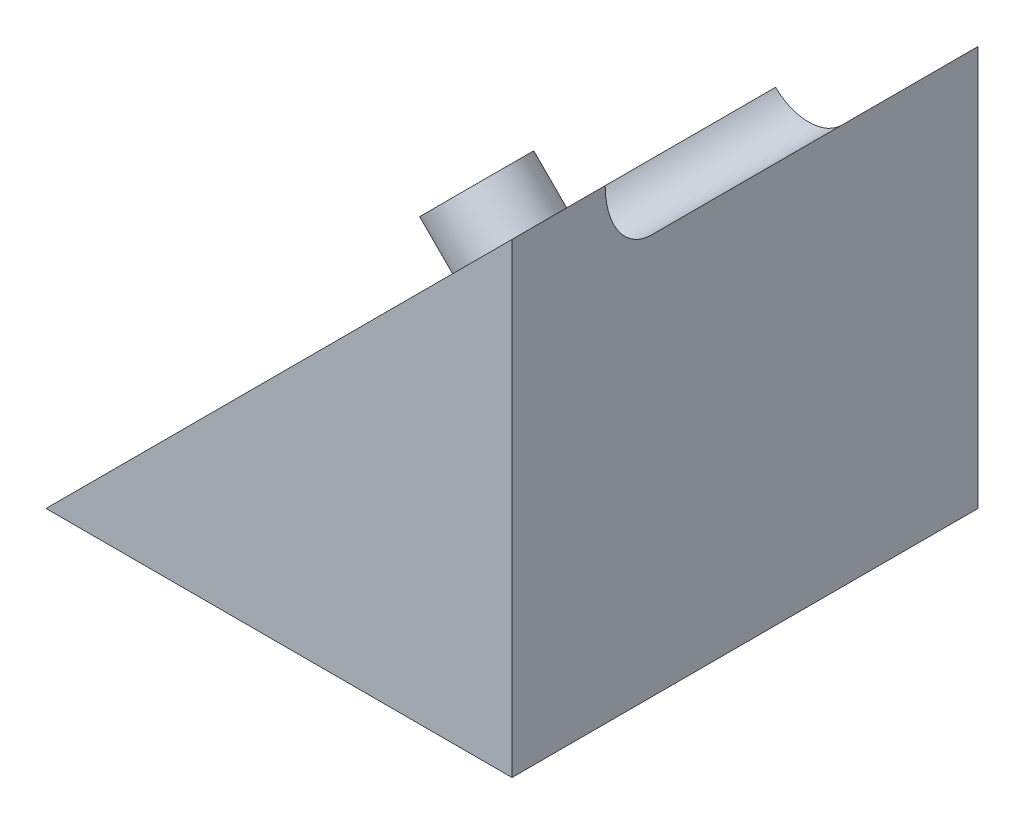
ISO-10303-21;
HEADER;
FILE_DESCRIPTION(('STEP AP214'),'2;1');
FILE_NAME('part.step','',(''),(''),'','','');
FILE_SCHEMA(('AUTOMOTIVE_DESIGN { 1 0 10303 214 1 1 1 1 }'));
ENDSEC;
DATA;
#1=APPLICATION_CONTEXT('core data for automotive mechanical design processes');
#2=APPLICATION_PROTOCOL_DEFINITION('international standard','automotive_design',2000,#1);
#3=PRODUCT_CONTEXT('',#1,'mechanical');
#4=PRODUCT('Part','Part','',(#3));
#5=PRODUCT_RELATED_PRODUCT_CATEGORY('part','',(#4));
#6=PRODUCT_DEFINITION_FORMATION('','',#4);
#7=PRODUCT_DEFINITION_CONTEXT('part definition',#1,'design');
#8=PRODUCT_DEFINITION('design','',#6,#7);
#9=PRODUCT_DEFINITION_SHAPE('','',#8);
#10=(LENGTH_UNIT() NAMED_UNIT(*) SI_UNIT(.MILLI.,.METRE.));
#11=(NAMED_UNIT(*) PLANE_ANGLE_UNIT() SI_UNIT($,.RADIAN.));
#12=(NAMED_UNIT(*) SI_UNIT($,.STERADIAN.) SOLID_ANGLE_UNIT());
#13=UNCERTAINTY_MEASURE_WITH_UNIT(LENGTH_MEASURE(1.E-05),#10,'distance_accuracy_value','');
#14=(GEOMETRIC_REPRESENTATION_CONTEXT(3) GLOBAL_UNCERTAINTY_ASSIGNED_CONTEXT((#13)) GLOBAL_UNIT_ASSIGNED_CONTEXT((#10,
#11,#12)) REPRESENTATION_CONTEXT('',''));
#15=CARTESIAN_POINT('',(0.,0.,0.));
#16=DIRECTION('',(0.,0.,1.));
#17=DIRECTION('',(1.,0.,0.));
#18=AXIS2_PLACEMENT_3D('',#15,#16,#17);
#19=CARTESIAN_POINT('',(0.,0.,5.));
#20=DIRECTION('',(0.707106781186544,-0.707106781186551,0.));
#21=DIRECTION('',(0.707106781186551,0.707106781186544,0.));
#22=AXIS2_PLACEMENT_3D('',#19,#20,#21);
#23=PLANE('',#22);
#24=CARTESIAN_POINT('',(2.47487373415293,2.4748737341529,2.5));
#25=DIRECTION('',(-0.707106781186544,0.707106781186551,0.));
#26=DIRECTION('',(-0.707106781186551,-0.707106781186544,0.));
#27=AXIS2_PLACEMENT_3D('',#24,#25,#26);
#28=CIRCLE('',#27,0.500000000000002);
#29=CARTESIAN_POINT('',(2.82842712474621,2.82842712474618,2.5));
#30=VERTEX_POINT('',#29);
#31=CARTESIAN_POINT('',(2.47487373415293,2.4748737341529,3.));
#32=VERTEX_POINT('',#31);
#33=EDGE_CURVE('E110',#30,#32,#28,.T.);
#34=ORIENTED_EDGE('',*,*,#33,.F.);
#35=DIRECTION('',(0.,0.,1.));
#36=VECTOR('',#35,1.);
#37=CARTESIAN_POINT('',(2.8284271247462,2.82842712474618,0.));
#38=LINE('',#37,#36);
#39=CARTESIAN_POINT('',(2.8284271247462,2.82842712474618,0.));
#40=VERTEX_POINT('',#39);
#41=EDGE_CURVE('E99',#40,#30,#38,.T.);
#42=ORIENTED_EDGE('',*,*,#41,.F.);
#43=DIRECTION('',(-0.707106781186551,-0.707106781186544,0.));
#44=VECTOR('',#43,1.);
#45=CARTESIAN_POINT('',(0.,0.,0.));
#46=LINE('',#45,#44);
#47=CARTESIAN_POINT('',(0.,0.,0.));
#48=VERTEX_POINT('',#47);
#49=EDGE_CURVE('E149',#40,#48,#46,.T.);
#50=ORIENTED_EDGE('',*,*,#49,.T.);
#51=DIRECTION('',(0.,0.,-1.));
#52=VECTOR('',#51,1.);
#53=CARTESIAN_POINT('',(0.,0.,5.));
#54=LINE('',#53,#52);
#55=CARTESIAN_POINT('',(0.,0.,3.));
#56=VERTEX_POINT('',#55);
#57=EDGE_CURVE('E174',#56,#48,#54,.T.);
#58=ORIENTED_EDGE('',*,*,#57,.F.);
#59=DIRECTION('',(0.707106781186551,0.707106781186544,0.));
#60=VECTOR('',#59,1.);
#61=CARTESIAN_POINT('',(0.,0.,3.));
#62=LINE('',#61,#60);
#63=EDGE_CURVE('E112',#56,#32,#62,.T.);
#64=ORIENTED_EDGE('',*,*,#63,.T.);
#65=EDGE_LOOP('',(#34,#42,#50,#58,#64));
#66=FACE_BOUND('',#65,.T.);
#67=ADVANCED_FACE('F33',(#66),#23,.F.);
#68=CARTESIAN_POINT('',(5.,4.99999999999995,5.));
#69=DIRECTION('',(-1.,0.,0.));
#70=DIRECTION('',(0.,-1.,0.));
#71=AXIS2_PLACEMENT_3D('',#68,#69,#70);
#72=PLANE('',#71);
#73=DIRECTION('',(0.,0.,-1.));
#74=VECTOR('',#73,1.);
#75=CARTESIAN_POINT('',(5.,4.29289321881341,5.));
#76=LINE('',#75,#74);
#77=CARTESIAN_POINT('',(5.,4.29289321881341,3.5));
#78=VERTEX_POINT('',#77);
#79=CARTESIAN_POINT('',(5.,4.29289321881341,0.));
#80=VERTEX_POINT('',#79);
#81=EDGE_CURVE('E154',#78,#80,#76,.T.);
#82=ORIENTED_EDGE('',*,*,#81,.F.);
#83=CARTESIAN_POINT('',(5.,4.99999999999995,3.5));
#84=DIRECTION('',(-1.,0.,0.));
#85=DIRECTION('',(0.,1.,0.));
#86=AXIS2_PLACEMENT_3D('',#83,#84,#85);
#87=ELLIPSE('',#86,0.707106781186544,0.5);
#88=CARTESIAN_POINT('',(5.,4.99999999999995,4.));
#89=VERTEX_POINT('',#88);
#90=EDGE_CURVE('E161',#78,#89,#87,.T.);
#91=ORIENTED_EDGE('',*,*,#90,.T.);
#92=DIRECTION('',(0.,0.,-1.));
#93=VECTOR('',#92,1.);
#94=CARTESIAN_POINT('',(5.,4.99999999999995,5.));
#95=LINE('',#94,#93);
#96=CARTESIAN_POINT('',(5.,4.99999999999995,5.));
#97=VERTEX_POINT('',#96);
#98=EDGE_CURVE('E136',#97,#89,#95,.T.);
#99=ORIENTED_EDGE('',*,*,#98,.F.);
#100=DIRECTION('',(0.,1.,0.));
#101=VECTOR('',#100,1.);
#102=CARTESIAN_POINT('',(5.,4.99999999999995,5.));
#103=LINE('',#102,#101);
#104=CARTESIAN_POINT('',(5.,0.,5.));
#105=VERTEX_POINT('',#104);
#106=EDGE_CURVE('E170',#105,#97,#103,.T.);
#107=ORIENTED_EDGE('',*,*,#106,.F.);
#108=DIRECTION('',(0.,0.,-1.));
#109=VECTOR('',#108,1.);
#110=CARTESIAN_POINT('',(5.,0.,5.));
#111=LINE('',#110,#109);
#112=CARTESIAN_POINT('',(5.,0.,0.));
#113=VERTEX_POINT('',#112);
#114=EDGE_CURVE('E128',#105,#113,#111,.T.);
#115=ORIENTED_EDGE('',*,*,#114,.T.);
#116=DIRECTION('',(0.,1.,0.));
#117=VECTOR('',#116,1.);
#118=CARTESIAN_POINT('',(5.,4.99999999999995,0.));
#119=LINE('',#118,#117);
#120=EDGE_CURVE('E177',#113,#80,#119,.T.);
#121=ORIENTED_EDGE('',*,*,#120,.T.);
#122=EDGE_LOOP('',(#82,#91,#99,#107,#115,#121));
#123=FACE_BOUND('',#122,.T.);
#124=ADVANCED_FACE('F185',(#123),#72,.F.);
#125=CARTESIAN_POINT('',(5.,0.,5.));
#126=DIRECTION('',(0.,1.,0.));
#127=DIRECTION('',(-1.,0.,0.));
#128=AXIS2_PLACEMENT_3D('',#125,#126,#127);
#129=PLANE('',#128);
#130=CARTESIAN_POINT('',(0.,0.,5.));
#131=VERTEX_POINT('',#130);
#132=CARTESIAN_POINT('',(0.,0.,4.));
#133=VERTEX_POINT('',#132);
#134=EDGE_CURVE('E180',#131,#133,#54,.T.);
#135=ORIENTED_EDGE('',*,*,#134,.T.);
#136=CARTESIAN_POINT('',(0.,0.,3.5));
#137=DIRECTION('',(0.,1.,0.));
#138=DIRECTION('',(1.,0.,0.));
#139=AXIS2_PLACEMENT_3D('',#136,#137,#138);
#140=ELLIPSE('',#139,0.707106781186551,0.5);
#141=EDGE_CURVE('E163',#133,#56,#140,.T.);
#142=ORIENTED_EDGE('',*,*,#141,.T.);
#143=ORIENTED_EDGE('',*,*,#57,.T.);
#144=DIRECTION('',(1.,0.,0.));
#145=VECTOR('',#144,1.);
#146=CARTESIAN_POINT('',(5.,0.,0.));
#147=LINE('',#146,#145);
#148=EDGE_CURVE('E166',#48,#113,#147,.T.);
#149=ORIENTED_EDGE('',*,*,#148,.T.);
#150=ORIENTED_EDGE('',*,*,#114,.F.);
#151=DIRECTION('',(1.,0.,0.));
#152=VECTOR('',#151,1.);
#153=CARTESIAN_POINT('',(5.,0.,5.));
#154=LINE('',#153,#152);
#155=EDGE_CURVE('E167',#131,#105,#154,.T.);
#156=ORIENTED_EDGE('',*,*,#155,.F.);
#157=EDGE_LOOP('',(#135,#142,#143,#149,#150,#156));
#158=FACE_BOUND('',#157,.T.);
#159=ADVANCED_FACE('F191',(#158),#129,.F.);
#160=ORIENTED_EDGE('',*,*,#98,.T.);
#161=DIRECTION('',(0.707106781186551,0.707106781186544,0.));
#162=VECTOR('',#161,1.);
#163=CARTESIAN_POINT('',(0.,0.,4.));
#164=LINE('',#163,#162);
#165=EDGE_CURVE('E125',#89,#133,#164,.F.);
#166=ORIENTED_EDGE('',*,*,#165,.T.);
#167=ORIENTED_EDGE('',*,*,#134,.F.);
#168=DIRECTION('',(-0.707106781186551,-0.707106781186544,0.));
#169=VECTOR('',#168,1.);
#170=CARTESIAN_POINT('',(0.,0.,5.));
#171=LINE('',#170,#169);
#172=EDGE_CURVE('E172',#97,#131,#171,.T.);
#173=ORIENTED_EDGE('',*,*,#172,.F.);
#174=EDGE_LOOP('',(#160,#166,#167,#173));
#175=FACE_BOUND('',#174,.T.);
#176=ADVANCED_FACE('F183',(#175),#23,.F.);
#177=CARTESIAN_POINT('',(0.,0.,5.));
#178=DIRECTION('',(0.,0.,1.));
#179=DIRECTION('',(1.,0.,0.));
#180=AXIS2_PLACEMENT_3D('',#177,#178,#179);
#181=PLANE('',#180);
#182=ORIENTED_EDGE('',*,*,#155,.T.);
#183=ORIENTED_EDGE('',*,*,#106,.T.);
#184=ORIENTED_EDGE('',*,*,#172,.T.);
#185=EDGE_LOOP('',(#182,#183,#184));
#186=FACE_BOUND('',#185,.T.);
#187=ADVANCED_FACE('F195',(#186),#181,.T.);
#188=CARTESIAN_POINT('',(0.,0.,0.));
#189=DIRECTION('',(0.,0.,1.));
#190=DIRECTION('',(1.,0.,0.));
#191=AXIS2_PLACEMENT_3D('',#188,#189,#190);
#192=PLANE('',#191);
#193=ORIENTED_EDGE('',*,*,#49,.F.);
#194=CARTESIAN_POINT('',(3.18198051533948,3.18198051533945,0.));
#195=DIRECTION('',(0.,0.,1.));
#196=DIRECTION('',(1.,0.,0.));
#197=AXIS2_PLACEMENT_3D('',#194,#195,#196);
#198=CIRCLE('',#197,0.5);
#199=CARTESIAN_POINT('',(3.53553390593275,2.82842712474617,0.));
#200=VERTEX_POINT('',#199);
#201=EDGE_CURVE('E102',#40,#200,#198,.T.);
#202=ORIENTED_EDGE('',*,*,#201,.T.);
#203=DIRECTION('',(-0.707106781186551,-0.707106781186544,0.));
#204=VECTOR('',#203,1.);
#205=CARTESIAN_POINT('',(5.35355339059327,4.64644660940667,0.));
#206=LINE('',#205,#204);
#207=EDGE_CURVE('E105',#80,#200,#206,.T.);
#208=ORIENTED_EDGE('',*,*,#207,.F.);
#209=ORIENTED_EDGE('',*,*,#120,.F.);
#210=ORIENTED_EDGE('',*,*,#148,.F.);
#211=EDGE_LOOP('',(#193,#202,#208,#209,#210));
#212=FACE_BOUND('',#211,.T.);
#213=ADVANCED_FACE('F146',(#212),#192,.F.);
#214=CARTESIAN_POINT('',(0.,0.,3.5));
#215=DIRECTION('',(0.707106781186551,0.707106781186544,0.));
#216=DIRECTION('',(-0.707106781186544,0.707106781186551,0.));
#217=AXIS2_PLACEMENT_3D('',#214,#215,#216);
#218=CYLINDRICAL_SURFACE('',#217,0.5);
#219=DIRECTION('',(0.707106781186551,0.707106781186544,0.));
#220=VECTOR('',#219,1.);
#221=CARTESIAN_POINT('',(5.35355339059327,4.64644660940667,3.5));
#222=LINE('',#221,#220);
#223=CARTESIAN_POINT('',(3.53553390593275,2.82842712474617,3.5));
#224=VERTEX_POINT('',#223);
#225=EDGE_CURVE('E155',#224,#78,#222,.T.);
#226=ORIENTED_EDGE('',*,*,#225,.F.);
#227=CARTESIAN_POINT('',(3.18198051533948,3.18198051533945,3.5));
#228=DIRECTION('',(-0.31622776601684,-0.316227766016836,0.894427190999916));
#229=DIRECTION('',(0.632455532033679,0.632455532033673,0.447213595499958));
#230=AXIS2_PLACEMENT_3D('',#227,#228,#229);
#231=ELLIPSE('',#230,1.11803398874989,0.5);
#232=EDGE_CURVE('E97',#224,#32,#231,.F.);
#233=ORIENTED_EDGE('',*,*,#232,.T.);
#234=ORIENTED_EDGE('',*,*,#63,.F.);
#235=ORIENTED_EDGE('',*,*,#141,.F.);
#236=ORIENTED_EDGE('',*,*,#165,.F.);
#237=ORIENTED_EDGE('',*,*,#90,.F.);
#238=EDGE_LOOP('',(#226,#233,#234,#235,#236,#237));
#239=FACE_BOUND('',#238,.T.);
#240=ADVANCED_FACE('F188',(#239),#218,.F.);
#241=CARTESIAN_POINT('',(0.353553390593272,-0.353553390593275,0.));
#242=DIRECTION('',(-0.707106781186544,0.707106781186551,0.));
#243=DIRECTION('',(-0.707106781186551,-0.707106781186544,0.));
#244=AXIS2_PLACEMENT_3D('',#241,#242,#243);
#245=PLANE('',#244);
#246=ORIENTED_EDGE('',*,*,#207,.T.);
#247=DIRECTION('',(0.,0.,1.));
#248=VECTOR('',#247,1.);
#249=CARTESIAN_POINT('',(3.53553390593275,2.82842712474617,0.));
#250=LINE('',#249,#248);
#251=EDGE_CURVE('E124',#200,#224,#250,.T.);
#252=ORIENTED_EDGE('',*,*,#251,.T.);
#253=ORIENTED_EDGE('',*,*,#225,.T.);
#254=ORIENTED_EDGE('',*,*,#81,.T.);
#255=EDGE_LOOP('',(#246,#252,#253,#254));
#256=FACE_BOUND('',#255,.T.);
#257=ADVANCED_FACE('F151',(#256),#245,.T.);
#258=CARTESIAN_POINT('',(3.18198051533948,3.18198051533945,0.));
#259=DIRECTION('',(0.,0.,1.));
#260=DIRECTION('',(1.,0.,0.));
#261=AXIS2_PLACEMENT_3D('',#258,#259,#260);
#262=CYLINDRICAL_SURFACE('',#261,0.5);
#263=ORIENTED_EDGE('',*,*,#41,.T.);
#264=CARTESIAN_POINT('',(3.18198051533948,3.18198051533945,3.5));
#265=DIRECTION('',(-0.632455532033679,-0.632455532033672,0.447213595499958));
#266=DIRECTION('',(0.31622776601684,0.316227766016836,0.894427190999916));
#267=AXIS2_PLACEMENT_3D('',#264,#265,#266);
#268=ELLIPSE('',#267,1.11803398874989,0.5);
#269=EDGE_CURVE('E11',#30,#224,#268,.T.);
#270=ORIENTED_EDGE('',*,*,#269,.T.);
#271=ORIENTED_EDGE('',*,*,#251,.F.);
#272=ORIENTED_EDGE('',*,*,#201,.F.);
#273=EDGE_LOOP('',(#263,#270,#271,#272));
#274=FACE_BOUND('',#273,.T.);
#275=ADVANCED_FACE('F101',(#274),#262,.F.);
#276=CARTESIAN_POINT('',(3.53553390593275,2.82842712474617,3.5));
#277=CARTESIAN_POINT('',(3.53553390593275,2.82842712474617,3.5));
#278=CARTESIAN_POINT('',(3.53553390593275,2.82842712474617,3.5));
#279=CARTESIAN_POINT('',(3.52012524493262,2.81303085764854,3.4564352528962));
#280=CARTESIAN_POINT('',(3.51247066523445,2.80527357581916,3.46731979465127));
#281=CARTESIAN_POINT('',(3.50472278088373,2.79762839359965,3.4782176264481));
#282=CARTESIAN_POINT('',(3.50371803883159,2.79862527009066,3.41285938220917));
#283=CARTESIAN_POINT('',(3.4872392512691,2.78416133463677,3.43454988183134));
#284=CARTESIAN_POINT('',(3.47290917795325,2.76781640921231,3.45642969110459));
#285=CARTESIAN_POINT('',(3.46915195186438,2.77209565097485,3.32645700606382));
#286=CARTESIAN_POINT('',(3.43378449052505,2.74677137257808,3.3703129623025));
#287=CARTESIAN_POINT('',(3.40779523794454,2.710738937055,3.41322850303191));
#288=CARTESIAN_POINT('',(3.45100914543579,2.75995326721384,3.28362727935863));
#289=CARTESIAN_POINT('',(3.4054184640037,2.73037416464592,3.33866057567258));
#290=CARTESIAN_POINT('',(3.37450983642114,2.68345395819919,3.39181363967931));
#291=CARTESIAN_POINT('',(3.41327105158844,2.73816661819593,3.19944658070181));
#292=CARTESIAN_POINT('',(3.34670366165455,2.70297290140798,3.27776732172684));
#293=CARTESIAN_POINT('',(3.30700937114117,2.63190493774865,3.34972329035091));
#294=CARTESIAN_POINT('',(3.39370523071915,2.72848386815234,3.15808285503677));
#295=CARTESIAN_POINT('',(3.3162025645745,2.69186224512765,3.24834336874866));
#296=CARTESIAN_POINT('',(3.27281926481542,2.60759790224862,3.32904142751839));
#297=CARTESIAN_POINT('',(3.35344135515527,2.71180562113585,3.07755453301332));
#298=CARTESIAN_POINT('',(3.25447453583069,2.67529375486737,3.19297936921756));
#299=CARTESIAN_POINT('',(3.20408432796137,2.56244859394195,3.28877726650666));
#300=CARTESIAN_POINT('',(3.33278306593885,2.70474980132181,3.03836086415335));
#301=CARTESIAN_POINT('',(3.2230881416272,2.66974481701591,3.16686214545613));
#302=CARTESIAN_POINT('',(3.16956898422971,2.54153571961267,3.26918043207667));
#303=CARTESIAN_POINT('',(3.29067795132372,2.6934678593409,2.96286016466005));
#304=CARTESIAN_POINT('',(3.16102175513214,2.66427873921457,3.1191094820019));
#305=CARTESIAN_POINT('',(3.10077034131657,2.50356024933375,3.23143008233003));
#306=CARTESIAN_POINT('',(3.26927715509219,2.68915881633842,2.92650096132887));
#307=CARTESIAN_POINT('',(3.13017963392082,2.66428785738456,3.09730725646704));
#308=CARTESIAN_POINT('',(3.06651462546803,2.48639628671425,3.21325048066443));
#309=CARTESIAN_POINT('',(3.22604719991801,2.68346756200429,2.85731592335453));
#310=CARTESIAN_POINT('',(3.07082227392721,2.66950624165304,3.05902521960531));
#311=CARTESIAN_POINT('',(2.9988240655397,2.45624442762597,3.17865796167726));
#312=CARTESIAN_POINT('',(3.20426520821525,2.68198037014404,2.82440832837437));
#313=CARTESIAN_POINT('',(3.04214948024553,2.67466050620199,3.04239510817202));
#314=CARTESIAN_POINT('',(2.96540748205543,2.44312264398421,3.16220416418718));
#315=CARTESIAN_POINT('',(3.16064519761858,2.68198065434923,2.76272071972454));
#316=CARTESIAN_POINT('',(2.98886352848905,2.68919542231525,3.01499398809069));
#317=CARTESIAN_POINT('',(2.89997760826303,2.42131306499367,3.13136035986227));
#318=CARTESIAN_POINT('',(3.13884909862307,2.68334410242034,2.73382458767201));
#319=CARTESIAN_POINT('',(2.96410737038541,2.6985389825205,3.00409563560105));
#320=CARTESIAN_POINT('',(2.86796518380531,2.41246018760258,3.116912293836));
#321=CARTESIAN_POINT('',(3.09558051571526,2.68904108905943,2.68069032666879));
#322=CARTESIAN_POINT('',(2.92030011364833,2.71980937345251,2.98815966496358));
#323=CARTESIAN_POINT('',(2.80591080276315,2.39937137610731,3.0903451633344));
#324=CARTESIAN_POINT('',(3.07413752119117,2.6932383732334,2.65630120919889));
#325=CARTESIAN_POINT('',(2.90113146510166,2.73171288859801,2.98302243986939));
#326=CARTESIAN_POINT('',(2.77584495306399,2.39494580510622,3.07815060459944));
#327=CARTESIAN_POINT('',(3.03195693124927,2.70454159656408,2.61263401856693));
#328=CARTESIAN_POINT('',(2.86963898603191,2.75580013151787,2.97778614717152));
#329=CARTESIAN_POINT('',(2.71822567981648,2.39081034513129,3.05631700928347));
#330=CARTESIAN_POINT('',(3.01123000641376,2.71151089084076,2.59317779084453));
#331=CARTESIAN_POINT('',(2.85723083855041,2.76796727081128,2.9776157286474));
#332=CARTESIAN_POINT('',(2.69061993970156,2.39090082412856,3.04658889542226));
#333=CARTESIAN_POINT('',(2.97085832240401,2.72823476415916,2.55973473624438));
#334=CARTESIAN_POINT('',(2.83924987770334,2.78998461136063,2.98046988010632));
#335=CARTESIAN_POINT('',(2.63842435034612,2.39580079210128,3.02986736812219));
#336=CARTESIAN_POINT('',(2.95120308649709,2.73786887530248,2.54556272569345));
#337=CARTESIAN_POINT('',(2.83362590623822,2.79981852904404,2.9834467616257));
#338=CARTESIAN_POINT('',(2.6137585520574,2.4004243408628,3.02278136284673));
#339=CARTESIAN_POINT('',(2.91333513041152,2.75973348950085,2.5229305825533));
#340=CARTESIAN_POINT('',(2.82745229781915,2.81519247544042,2.98995238299867));
#341=CARTESIAN_POINT('',(2.56788892502825,2.41428728411757,3.01146529127665));
#342=CARTESIAN_POINT('',(2.89509681751645,2.77187734601922,2.51431171969006));
#343=CARTESIAN_POINT('',(2.82687617923023,2.82071596934452,2.99345070563311));
#344=CARTESIAN_POINT('',(2.54660338394481,2.42338391244759,3.00715585984503));
#345=CARTESIAN_POINT('',(2.86038985077463,2.79851006111571,2.50289300350723));
#346=CARTESIAN_POINT('',(2.82737444964799,2.82733363732446,2.99848243392863));
#347=CARTESIAN_POINT('',(2.50785929138033,2.44597950172141,3.00144650175361));
#348=CARTESIAN_POINT('',(2.84389707216093,2.81295717733145,2.5));
#349=CARTESIAN_POINT('',(2.82843735760065,2.82841689189173,3.));
#350=CARTESIAN_POINT('',(2.49034368156765,2.45940378673818,3.));
#351=CARTESIAN_POINT('',(2.81295717733148,2.8438970721609,2.5));
#352=CARTESIAN_POINT('',(2.82841689189176,2.82843735760062,3.));
#353=CARTESIAN_POINT('',(2.45940378673821,2.49034368156763,3.));
#354=CARTESIAN_POINT('',(2.79851006111574,2.8603898507746,2.50289300350723));
#355=CARTESIAN_POINT('',(2.82733363732449,2.82737444964796,2.99848243392863));
#356=CARTESIAN_POINT('',(2.44597950172144,2.50785929138031,3.00144650175361));
#357=CARTESIAN_POINT('',(2.77187734601925,2.89509681751642,2.51431171969006));
#358=CARTESIAN_POINT('',(2.82071596934455,2.8268761792302,2.99345070563311));
#359=CARTESIAN_POINT('',(2.42338391244762,2.54660338394479,3.00715585984503));
#360=CARTESIAN_POINT('',(2.75973348950088,2.91333513041149,2.5229305825533));
#361=CARTESIAN_POINT('',(2.81519247544045,2.82745229781912,2.98995238299867));
#362=CARTESIAN_POINT('',(2.4142872841176,2.56788892502822,3.01146529127665));
#363=CARTESIAN_POINT('',(2.73786887530251,2.95120308649706,2.54556272569345));
#364=CARTESIAN_POINT('',(2.79981852904407,2.83362590623819,2.9834467616257));
#365=CARTESIAN_POINT('',(2.40042434086282,2.61375855205738,3.02278136284673));
#366=CARTESIAN_POINT('',(2.72823476415919,2.97085832240398,2.55973473624438));
#367=CARTESIAN_POINT('',(2.78998461136066,2.83924987770332,2.98046988010632));
#368=CARTESIAN_POINT('',(2.39580079210131,2.6384243503461,3.02986736812219));
#369=CARTESIAN_POINT('',(2.71151089084079,3.01123000641374,2.59317779084453));
#370=CARTESIAN_POINT('',(2.76796727081131,2.85723083855038,2.9776157286474));
#371=CARTESIAN_POINT('',(2.39090082412859,2.69061993970154,3.04658889542226));
#372=CARTESIAN_POINT('',(2.70454159656411,3.03195693124924,2.61263401856693));
#373=CARTESIAN_POINT('',(2.7558001315179,2.86963898603188,2.97778614717152));
#374=CARTESIAN_POINT('',(2.39081034513132,2.71822567981645,3.05631700928347));
#375=CARTESIAN_POINT('',(2.69323837323343,3.07413752119114,2.65630120919889));
#376=CARTESIAN_POINT('',(2.73171288859804,2.90113146510164,2.98302243986939));
#377=CARTESIAN_POINT('',(2.39494580510625,2.77584495306396,3.07815060459944));
#378=CARTESIAN_POINT('',(2.68904108905946,3.09558051571524,2.68069032666879));
#379=CARTESIAN_POINT('',(2.71980937345254,2.9203001136483,2.98815966496358));
#380=CARTESIAN_POINT('',(2.39937137610734,2.80591080276312,3.0903451633344));
#381=CARTESIAN_POINT('',(2.68334410242037,3.13884909862304,2.73382458767201));
#382=CARTESIAN_POINT('',(2.69853898252053,2.96410737038539,3.00409563560105));
#383=CARTESIAN_POINT('',(2.41246018760261,2.86796518380528,3.11691229383601));
#384=CARTESIAN_POINT('',(2.68198065434926,3.16064519761856,2.76272071972454));
#385=CARTESIAN_POINT('',(2.68919542231528,2.98886352848902,3.01499398809069));
#386=CARTESIAN_POINT('',(2.4213130649937,2.899977608263,3.13136035986227));
#387=CARTESIAN_POINT('',(2.68198037014407,3.20426520821522,2.82440832837436));
#388=CARTESIAN_POINT('',(2.67466050620202,3.0421494802455,3.04239510817202));
#389=CARTESIAN_POINT('',(2.44312264398425,2.9654074820554,3.16220416418718));
#390=CARTESIAN_POINT('',(2.68346756200432,3.22604719991798,2.85731592335453));
#391=CARTESIAN_POINT('',(2.66950624165307,3.07082227392718,3.05902521960531));
#392=CARTESIAN_POINT('',(2.45624442762601,2.99882406553967,3.17865796167727));
#393=CARTESIAN_POINT('',(2.68915881633845,3.26927715509216,2.92650096132887));
#394=CARTESIAN_POINT('',(2.66428785738459,3.13017963392079,3.09730725646704));
#395=CARTESIAN_POINT('',(2.48639628671429,3.066514625468,3.21325048066443));
#396=CARTESIAN_POINT('',(2.69346785934094,3.29067795132369,2.96286016466005));
#397=CARTESIAN_POINT('',(2.6642787392146,3.16102175513211,3.1191094820019));
#398=CARTESIAN_POINT('',(2.50356024933378,3.10077034131654,3.23143008233003));
#399=CARTESIAN_POINT('',(2.70474980132184,3.33278306593882,3.03836086415334));
#400=CARTESIAN_POINT('',(2.66974481701594,3.22308814162718,3.16686214545613));
#401=CARTESIAN_POINT('',(2.54153571961271,3.16956898422969,3.26918043207667));
#402=CARTESIAN_POINT('',(2.71180562113589,3.35344135515524,3.07755453301332));
#403=CARTESIAN_POINT('',(2.6752937548674,3.25447453583067,3.19297936921756));
#404=CARTESIAN_POINT('',(2.56244859394198,3.20408432796134,3.28877726650666));
#405=CARTESIAN_POINT('',(2.72848386815237,3.39370523071912,3.15808285503677));
#406=CARTESIAN_POINT('',(2.69186224512768,3.31620256457447,3.24834336874866));
#407=CARTESIAN_POINT('',(2.60759790224865,3.2728192648154,3.32904142751839));
#408=CARTESIAN_POINT('',(2.73816661819596,3.41327105158842,3.19944658070181));
#409=CARTESIAN_POINT('',(2.70297290140802,3.34670366165452,3.27776732172684));
#410=CARTESIAN_POINT('',(2.63190493774869,3.30700937114114,3.34972329035091));
#411=CARTESIAN_POINT('',(2.75995326721387,3.45100914543576,3.28362727935863));
#412=CARTESIAN_POINT('',(2.73037416464596,3.40541846400368,3.33866057567258));
#413=CARTESIAN_POINT('',(2.68345395819922,3.37450983642112,3.39181363967932));
#414=CARTESIAN_POINT('',(2.77209565097489,3.46915195186435,3.32645700606382));
#415=CARTESIAN_POINT('',(2.74677137257811,3.43378449052502,3.3703129623025));
#416=CARTESIAN_POINT('',(2.71073893705504,3.40779523794451,3.41322850303191));
#417=CARTESIAN_POINT('',(2.79862527009069,3.50371803883156,3.41285938220917));
#418=CARTESIAN_POINT('',(2.78416133463681,3.48723925126908,3.43454988183134));
#419=CARTESIAN_POINT('',(2.76781640921235,3.47290917795322,3.45642969110459));
#420=CARTESIAN_POINT('',(2.81303085764857,3.52012524493259,3.4564352528962));
#421=CARTESIAN_POINT('',(2.80527357581919,3.51247066523443,3.46731979465127));
#422=CARTESIAN_POINT('',(2.79762839359969,3.5047227808837,3.4782176264481));
#423=CARTESIAN_POINT('',(2.82842712474621,3.53553390593272,3.5));
#424=CARTESIAN_POINT('',(2.82842712474621,3.53553390593272,3.5));
#425=CARTESIAN_POINT('',(2.82842712474621,3.53553390593272,3.5));
#426=(BOUNDED_SURFACE() B_SPLINE_SURFACE(3,2,((#276,#277,#278),(#279,#280,#281),(#282,#283,
#284),(#285,#286,#287),(#288,#289,#290),(#291,#292,#293),(#294,#295,#296),(#297,#298,#299),
(#300,#301,#302),(#303,#304,#305),(#306,#307,#308),(#309,#310,#311),(#312,#313,#314),(#315,#316,
#317),(#318,#319,#320),(#321,#322,#323),(#324,#325,#326),(#327,#328,#329),(#330,#331,#332),
(#333,#334,#335),(#336,#337,#338),(#339,#340,#341),(#342,#343,#344),(#345,#346,#347),(#348,#349,
#350),(#351,#352,#353),(#354,#355,#356),(#357,#358,#359),(#360,#361,#362),(#363,#364,#365),
(#366,#367,#368),(#369,#370,#371),(#372,#373,#374),(#375,#376,#377),(#378,#379,#380),(#381,#382,
#383),(#384,#385,#386),(#387,#388,#389),(#390,#391,#392),(#393,#394,#395),(#396,#397,#398),
(#399,#400,#401),(#402,#403,#404),(#405,#406,#407),(#408,#409,#410),(#411,#412,#413),(#414,#415,
#416),(#417,#418,#419),(#420,#421,#422),(#423,#424,#425)),.UNSPECIFIED.,.F.,.F.,
.F.) B_SPLINE_SURFACE_WITH_KNOTS((4,2,2,2,2,2,2,2,2,2,2,2,2,2,2,2,2,2,2,2,2,2,2,2,4),(3,3),(0.,
0.184790054136701,0.368009412702062,0.548155641317347,0.723864076783649,0.893979701264172,
1.05763203258689,1.21431242769035,1.3639503442247,1.50697963305437,1.64437747900847,
1.77764975070831,1.90873547704528,2.03982120338226,2.1730934750821,2.3104913210362,
2.45352060986587,2.60315852640021,2.75983892150368,2.92349125282639,3.09360687730692,
3.26931531277322,3.4494615413885,3.63268089995386,3.81747095409057),(0.,1.),
.UNSPECIFIED.) GEOMETRIC_REPRESENTATION_ITEM() RATIONAL_B_SPLINE_SURFACE(((1.,1.,1.),(1.,
1.00000566557019,1.),(1.,0.998576699090688,1.),(1.,0.992910721279765,1.),(1.,0.988697681267574,
1.),(1.,0.977617128833049,1.),(1.,0.970795325018433,1.),(1.,0.954789124900482,1.),(1.,
0.945667069465631,1.),(1.,0.92548796875733,1.),(1.,0.914501756375306,1.),(1.,0.891169998194024,
1.),(1.,0.878891956959708,1.),(1.,0.853706993048538,1.),(1.,0.84084914596985,1.),(1.,
0.815387454422431,1.),(1.,0.802798170091792,1.),(1.,0.778880732263429,1.),(1.,0.767521437046521,
1.),(1.,0.747118526989835,1.),(1.,0.738001346912332,1.),(1.,0.723039691293395,1.),(1.,
0.717105167896984,1.),(1.,0.709170186451793,1.),(1.,0.707106781186547,1.),(1.,0.707106781186547,
1.),(1.,0.709170186451792,1.),(1.,0.717105167896983,1.),(1.,0.723039691293395,1.),(1.,
0.738001346912332,1.),(1.,0.747118526989836,1.),(1.,0.767521437046521,1.),(1.,0.778880732263429,
1.),(1.,0.802798170091792,1.),(1.,0.815387454422431,1.),(1.,0.84084914596985,1.),(1.,
0.853706993048538,1.),(1.,0.878891956959708,1.),(1.,0.891169998194024,1.),(1.,0.914501756375306,
1.),(1.,0.925487968757329,1.),(1.,0.94566706946563,1.),(1.,0.954789124900482,1.),(1.,
0.970795325018433,1.),(1.,0.97761712883305,1.),(1.,0.988697681267574,1.),(1.,0.992910721279765,
1.),(1.,0.998576699090688,1.),(1.,1.00000566557019,1.),(1.,1.,1.))) REPRESENTATION_ITEM('') SURFACE());
#427=ORIENTED_EDGE('',*,*,#232,.F.);
#428=ORIENTED_EDGE('',*,*,#269,.F.);
#429=CARTESIAN_POINT('',(2.47487373415293,2.4748737341529,2.5));
#430=DIRECTION('',(0.707106781186544,-0.707106781186551,0.));
#431=DIRECTION('',(0.707106781186551,0.707106781186544,0.));
#432=AXIS2_PLACEMENT_3D('',#429,#430,#431);
#433=CIRCLE('',#432,0.5);
#434=EDGE_CURVE('E46',#32,#30,#433,.F.);
#435=ORIENTED_EDGE('',*,*,#434,.F.);
#436=EDGE_LOOP('',(#427,#428,#435));
#437=FACE_BOUND('',#436,.T.);
#438=ADVANCED_FACE('F35',(#437),#426,.T.);
#439=CARTESIAN_POINT('',(2.12132034355966,2.82842712474618,2.5));
#440=DIRECTION('',(0.707106781186544,-0.707106781186551,0.));
#441=DIRECTION('',(0.707106781186551,0.707106781186544,0.));
#442=AXIS2_PLACEMENT_3D('',#439,#440,#441);
#443=CYLINDRICAL_SURFACE('',#442,0.500000000000002);
#444=CARTESIAN_POINT('',(2.12132034355966,2.82842712474618,2.5));
#445=DIRECTION('',(-0.707106781186544,0.707106781186551,0.));
#446=DIRECTION('',(-0.707106781186551,-0.707106781186544,0.));
#447=AXIS2_PLACEMENT_3D('',#444,#445,#446);
#448=CIRCLE('',#447,0.500000000000002);
#449=CARTESIAN_POINT('',(1.76776695296638,2.47487373415291,2.5));
#450=VERTEX_POINT('',#449);
#451=EDGE_CURVE('E106',#450,#450,#448,.T.);
#452=ORIENTED_EDGE('',*,*,#451,.F.);
#453=EDGE_LOOP('',(#452));
#454=FACE_BOUND('',#453,.T.);
#455=ORIENTED_EDGE('',*,*,#434,.T.);
#456=ORIENTED_EDGE('',*,*,#33,.T.);
#457=EDGE_LOOP('',(#455,#456));
#458=FACE_BOUND('',#457,.T.);
#459=ADVANCED_FACE('F115',(#454,#458),#443,.T.);
#460=CARTESIAN_POINT('',(2.12132034355966,2.82842712474618,2.5));
#461=DIRECTION('',(-0.707106781186544,0.707106781186551,0.));
#462=DIRECTION('',(-0.707106781186551,-0.707106781186544,0.));
#463=AXIS2_PLACEMENT_3D('',#460,#461,#462);
#464=PLANE('',#463);
#465=ORIENTED_EDGE('',*,*,#451,.T.);
#466=EDGE_LOOP('',(#465));
#467=FACE_BOUND('',#466,.T.);
#468=ADVANCED_FACE('F225',(#467),#464,.T.);
#469=CLOSED_SHELL('',(#67,#124,#159,#176,#187,#213,#240,#257,#275,#438,#459,#468));
#470=MANIFOLD_SOLID_BREP('B2',#469);
#471=ADVANCED_BREP_SHAPE_REPRESENTATION('',(#18,#470),#14);
#472=SHAPE_DEFINITION_REPRESENTATION(#9,#471);
ENDSEC;
END-ISO-10303-21;
